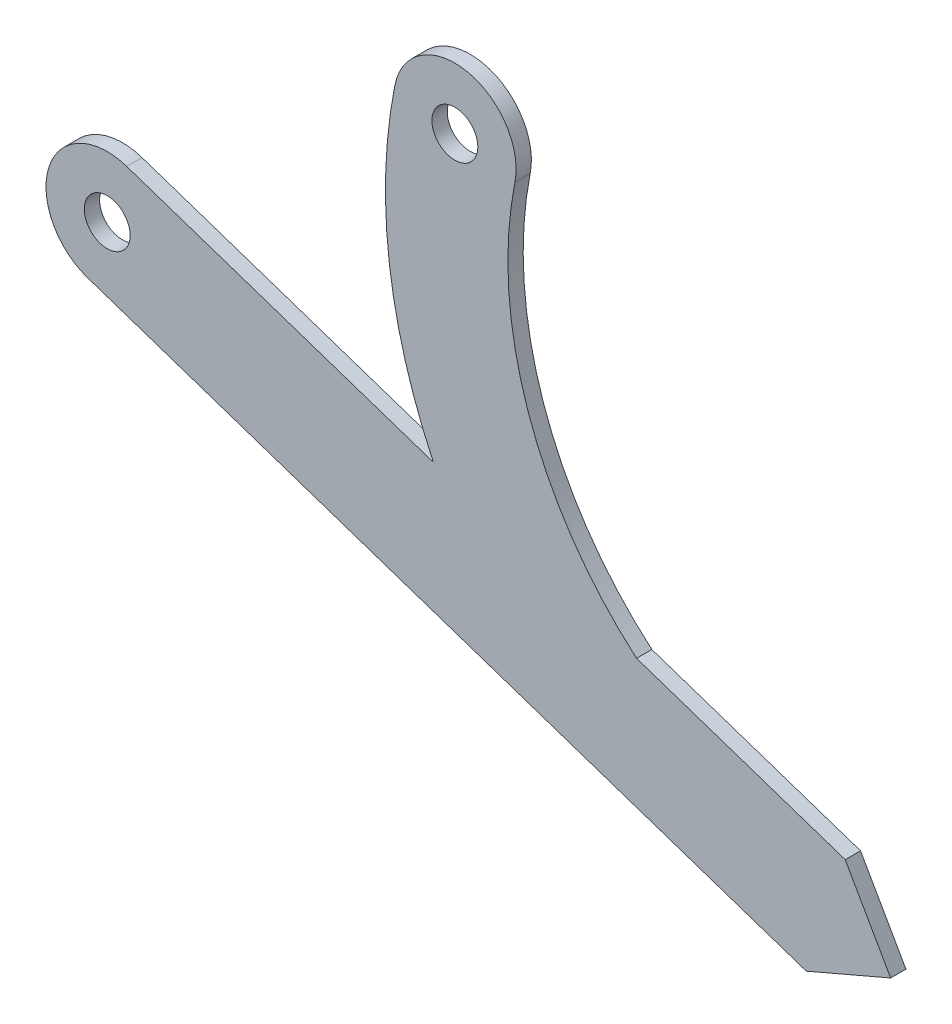
ISO-10303-21;
HEADER;
FILE_DESCRIPTION(('STEP AP214'),'2;1');
FILE_NAME('part.step','',(''),(''),'','','');
FILE_SCHEMA(('AUTOMOTIVE_DESIGN { 1 0 10303 214 1 1 1 1 }'));
ENDSEC;
DATA;
#1=APPLICATION_CONTEXT('core data for automotive mechanical design processes');
#2=APPLICATION_PROTOCOL_DEFINITION('international standard','automotive_design',2000,#1);
#3=PRODUCT_CONTEXT('',#1,'mechanical');
#4=PRODUCT('Part','Part','',(#3));
#5=PRODUCT_RELATED_PRODUCT_CATEGORY('part','',(#4));
#6=PRODUCT_DEFINITION_FORMATION('','',#4);
#7=PRODUCT_DEFINITION_CONTEXT('part definition',#1,'design');
#8=PRODUCT_DEFINITION('design','',#6,#7);
#9=PRODUCT_DEFINITION_SHAPE('','',#8);
#10=(LENGTH_UNIT() NAMED_UNIT(*) SI_UNIT(.MILLI.,.METRE.));
#11=(NAMED_UNIT(*) PLANE_ANGLE_UNIT() SI_UNIT($,.RADIAN.));
#12=(NAMED_UNIT(*) SI_UNIT($,.STERADIAN.) SOLID_ANGLE_UNIT());
#13=UNCERTAINTY_MEASURE_WITH_UNIT(LENGTH_MEASURE(1.E-05),#10,'distance_accuracy_value','');
#14=(GEOMETRIC_REPRESENTATION_CONTEXT(3) GLOBAL_UNCERTAINTY_ASSIGNED_CONTEXT((#13)) GLOBAL_UNIT_ASSIGNED_CONTEXT((#10,
#11,#12)) REPRESENTATION_CONTEXT('',''));
#15=CARTESIAN_POINT('',(0.,0.,0.));
#16=DIRECTION('',(0.,0.,1.));
#17=DIRECTION('',(1.,0.,0.));
#18=AXIS2_PLACEMENT_3D('',#15,#16,#17);
#19=CARTESIAN_POINT('',(-4.19072103136245,-39.3339762298644,1.));
#20=DIRECTION('',(0.,0.,1.));
#21=DIRECTION('',(1.,0.,0.));
#22=AXIS2_PLACEMENT_3D('',#19,#20,#21);
#23=PLANE('',#22);
#24=CARTESIAN_POINT('',(-54.4670684293197,-50.2361322589974,1.));
#25=DIRECTION('',(0.,0.,1.));
#26=DIRECTION('',(1.,0.,0.));
#27=AXIS2_PLACEMENT_3D('',#24,#25,#26);
#28=CIRCLE('',#27,1.5);
#29=CARTESIAN_POINT('',(-52.9670684293197,-50.2361322589974,1.));
#30=VERTEX_POINT('',#29);
#31=EDGE_CURVE('E148',#30,#30,#28,.T.);
#32=ORIENTED_EDGE('',*,*,#31,.F.);
#33=EDGE_LOOP('',(#32));
#34=FACE_BOUND('',#33,.T.);
#35=DIRECTION('',(-0.494588080333751,0.869127511238584,0.));
#36=VECTOR('',#35,1.);
#37=CARTESIAN_POINT('',(-3.27169179195761,-67.4126688993869,1.));
#38=LINE('',#37,#36);
#39=CARTESIAN_POINT('',(-3.27169179195761,-67.4126688993869,1.));
#40=VERTEX_POINT('',#39);
#41=CARTESIAN_POINT('',(-6.23922027396012,-62.1979038319553,1.));
#42=VERTEX_POINT('',#41);
#43=EDGE_CURVE('E161',#40,#42,#38,.T.);
#44=ORIENTED_EDGE('',*,*,#43,.T.);
#45=DIRECTION('',(-0.948062530321522,0.318084011859058,0.));
#46=VECTOR('',#45,1.);
#47=CARTESIAN_POINT('',(-19.8762500679618,-57.6225504053765,1.));
#48=LINE('',#47,#46);
#49=CARTESIAN_POINT('',(-19.8762500679618,-57.6225504053765,1.));
#50=VERTEX_POINT('',#49);
#51=EDGE_CURVE('E104',#42,#50,#48,.T.);
#52=ORIENTED_EDGE('',*,*,#51,.T.);
#53=CARTESIAN_POINT('',(-4.19072103136245,-39.3339762298644,1.));
#54=DIRECTION('',(0.,0.,-1.));
#55=DIRECTION('',(1.,0.,0.));
#56=AXIS2_PLACEMENT_3D('',#53,#54,#55);
#57=CIRCLE('',#56,24.0937287801455);
#58=CARTESIAN_POINT('',(-27.8243929204884,-34.6481124281363,1.));
#59=VERTEX_POINT('',#58);
#60=EDGE_CURVE('E179',#50,#59,#57,.T.);
#61=ORIENTED_EDGE('',*,*,#60,.T.);
#62=CARTESIAN_POINT('',(-31.74801505549,-33.8701732648816,1.));
#63=DIRECTION('',(0.,0.,1.));
#64=DIRECTION('',(1.,0.,0.));
#65=AXIS2_PLACEMENT_3D('',#62,#63,#64);
#66=CIRCLE('',#65,4.);
#67=CARTESIAN_POINT('',(-35.6716371904916,-33.0922341016269,1.));
#68=VERTEX_POINT('',#67);
#69=EDGE_CURVE('E196',#59,#68,#66,.T.);
#70=ORIENTED_EDGE('',*,*,#69,.T.);
#71=CARTESIAN_POINT('',(-4.19072103136245,-39.3339762298644,1.));
#72=DIRECTION('',(0.,0.,1.));
#73=DIRECTION('',(1.,0.,0.));
#74=AXIS2_PLACEMENT_3D('',#71,#72,#73);
#75=CIRCLE('',#74,32.0937287801455);
#76=CARTESIAN_POINT('',(-33.1491254924629,-53.1693742393491,1.));
#77=VERTEX_POINT('',#76);
#78=EDGE_CURVE('E195',#68,#77,#75,.T.);
#79=ORIENTED_EDGE('',*,*,#78,.T.);
#80=DIRECTION('',(-0.948062530321522,0.318084011859058,0.));
#81=VECTOR('',#80,1.);
#82=CARTESIAN_POINT('',(-53.1947323818834,-46.443882137711,1.));
#83=LINE('',#82,#81);
#84=CARTESIAN_POINT('',(-53.1947323818834,-46.443882137711,1.));
#85=VERTEX_POINT('',#84);
#86=EDGE_CURVE('E126',#77,#85,#83,.T.);
#87=ORIENTED_EDGE('',*,*,#86,.T.);
#88=CARTESIAN_POINT('',(-54.4670684293197,-50.2361322589974,1.));
#89=DIRECTION('',(0.,0.,1.));
#90=DIRECTION('',(1.,0.,0.));
#91=AXIS2_PLACEMENT_3D('',#88,#89,#90);
#92=CIRCLE('',#91,4.00000000000029);
#93=CARTESIAN_POINT('',(-55.739404476756,-54.0283823802838,1.));
#94=VERTEX_POINT('',#93);
#95=EDGE_CURVE('E120',#85,#94,#92,.T.);
#96=ORIENTED_EDGE('',*,*,#95,.T.);
#97=DIRECTION('',(0.948062530321522,-0.318084011859058,0.));
#98=VECTOR('',#97,1.);
#99=CARTESIAN_POINT('',(-55.739404476756,-54.0283823802838,1.));
#100=LINE('',#99,#98);
#101=CARTESIAN_POINT('',(-8.78389236883263,-69.7824040745275,1.));
#102=VERTEX_POINT('',#101);
#103=EDGE_CURVE('E124',#94,#102,#100,.T.);
#104=ORIENTED_EDGE('',*,*,#103,.T.);
#105=DIRECTION('',(0.918700096145835,0.394955862523439,0.));
#106=VECTOR('',#105,1.);
#107=CARTESIAN_POINT('',(-3.27169179195761,-67.4126688993869,1.));
#108=LINE('',#107,#106);
#109=EDGE_CURVE('E58',#102,#40,#108,.T.);
#110=ORIENTED_EDGE('',*,*,#109,.T.);
#111=EDGE_LOOP('',(#44,#52,#61,#70,#79,#87,#96,#104,#110));
#112=FACE_BOUND('',#111,.T.);
#113=CARTESIAN_POINT('',(-31.74801505549,-33.8701732648816,1.));
#114=DIRECTION('',(0.,0.,1.));
#115=DIRECTION('',(1.,0.,0.));
#116=AXIS2_PLACEMENT_3D('',#113,#114,#115);
#117=CIRCLE('',#116,1.5);
#118=CARTESIAN_POINT('',(-30.24801505549,-33.8701732648816,1.));
#119=VERTEX_POINT('',#118);
#120=EDGE_CURVE('E206',#119,#119,#117,.T.);
#121=ORIENTED_EDGE('',*,*,#120,.F.);
#122=EDGE_LOOP('',(#121));
#123=FACE_BOUND('',#122,.T.);
#124=ADVANCED_FACE('F41',(#34,#112,#123),#23,.T.);
#125=CARTESIAN_POINT('',(-4.19072103136245,-39.3339762298644,0.));
#126=DIRECTION('',(0.,0.,1.));
#127=DIRECTION('',(1.,0.,0.));
#128=AXIS2_PLACEMENT_3D('',#125,#126,#127);
#129=PLANE('',#128);
#130=DIRECTION('',(-0.494588080333751,0.869127511238584,0.));
#131=VECTOR('',#130,1.);
#132=CARTESIAN_POINT('',(-3.27169179195761,-67.4126688993869,0.));
#133=LINE('',#132,#131);
#134=CARTESIAN_POINT('',(-3.27169179195761,-67.4126688993869,0.));
#135=VERTEX_POINT('',#134);
#136=CARTESIAN_POINT('',(-6.23922027396012,-62.1979038319553,0.));
#137=VERTEX_POINT('',#136);
#138=EDGE_CURVE('E144',#135,#137,#133,.T.);
#139=ORIENTED_EDGE('',*,*,#138,.F.);
#140=DIRECTION('',(0.918700096145835,0.394955862523439,0.));
#141=VECTOR('',#140,1.);
#142=CARTESIAN_POINT('',(-3.27169179195761,-67.4126688993869,0.));
#143=LINE('',#142,#141);
#144=CARTESIAN_POINT('',(-8.78389236883263,-69.7824040745275,0.));
#145=VERTEX_POINT('',#144);
#146=EDGE_CURVE('E96',#145,#135,#143,.T.);
#147=ORIENTED_EDGE('',*,*,#146,.F.);
#148=DIRECTION('',(0.948062530321522,-0.318084011859058,0.));
#149=VECTOR('',#148,1.);
#150=CARTESIAN_POINT('',(-55.739404476756,-54.0283823802838,0.));
#151=LINE('',#150,#149);
#152=CARTESIAN_POINT('',(-55.739404476756,-54.0283823802838,0.));
#153=VERTEX_POINT('',#152);
#154=EDGE_CURVE('E90',#153,#145,#151,.T.);
#155=ORIENTED_EDGE('',*,*,#154,.F.);
#156=CARTESIAN_POINT('',(-54.4670684293197,-50.2361322589974,0.));
#157=DIRECTION('',(0.,0.,1.));
#158=DIRECTION('',(1.,0.,0.));
#159=AXIS2_PLACEMENT_3D('',#156,#157,#158);
#160=CIRCLE('',#159,4.00000000000029);
#161=CARTESIAN_POINT('',(-53.1947323818834,-46.443882137711,0.));
#162=VERTEX_POINT('',#161);
#163=EDGE_CURVE('E134',#162,#153,#160,.T.);
#164=ORIENTED_EDGE('',*,*,#163,.F.);
#165=DIRECTION('',(-0.948062530321522,0.318084011859058,0.));
#166=VECTOR('',#165,1.);
#167=CARTESIAN_POINT('',(-53.1947323818834,-46.443882137711,0.));
#168=LINE('',#167,#166);
#169=CARTESIAN_POINT('',(-33.1491254924629,-53.1693742393491,0.));
#170=VERTEX_POINT('',#169);
#171=EDGE_CURVE('E156',#170,#162,#168,.T.);
#172=ORIENTED_EDGE('',*,*,#171,.F.);
#173=CARTESIAN_POINT('',(-4.19072103136245,-39.3339762298644,0.));
#174=DIRECTION('',(0.,0.,1.));
#175=DIRECTION('',(1.,0.,0.));
#176=AXIS2_PLACEMENT_3D('',#173,#174,#175);
#177=CIRCLE('',#176,32.0937287801455);
#178=CARTESIAN_POINT('',(-35.6716371904916,-33.0922341016269,0.));
#179=VERTEX_POINT('',#178);
#180=EDGE_CURVE('E154',#179,#170,#177,.T.);
#181=ORIENTED_EDGE('',*,*,#180,.F.);
#182=CARTESIAN_POINT('',(-31.74801505549,-33.8701732648816,0.));
#183=DIRECTION('',(0.,0.,1.));
#184=DIRECTION('',(1.,0.,0.));
#185=AXIS2_PLACEMENT_3D('',#182,#183,#184);
#186=CIRCLE('',#185,4.);
#187=CARTESIAN_POINT('',(-27.8243929204884,-34.6481124281363,0.));
#188=VERTEX_POINT('',#187);
#189=EDGE_CURVE('E152',#188,#179,#186,.T.);
#190=ORIENTED_EDGE('',*,*,#189,.F.);
#191=CARTESIAN_POINT('',(-4.19072103136245,-39.3339762298644,0.));
#192=DIRECTION('',(0.,0.,-1.));
#193=DIRECTION('',(1.,0.,0.));
#194=AXIS2_PLACEMENT_3D('',#191,#192,#193);
#195=CIRCLE('',#194,24.0937287801455);
#196=CARTESIAN_POINT('',(-19.8762500679618,-57.6225504053765,0.));
#197=VERTEX_POINT('',#196);
#198=EDGE_CURVE('E150',#197,#188,#195,.T.);
#199=ORIENTED_EDGE('',*,*,#198,.F.);
#200=DIRECTION('',(-0.948062530321522,0.318084011859058,0.));
#201=VECTOR('',#200,1.);
#202=CARTESIAN_POINT('',(-19.8762500679618,-57.6225504053765,0.));
#203=LINE('',#202,#201);
#204=EDGE_CURVE('E147',#137,#197,#203,.T.);
#205=ORIENTED_EDGE('',*,*,#204,.F.);
#206=EDGE_LOOP('',(#139,#147,#155,#164,#172,#181,#190,#199,#205));
#207=FACE_BOUND('',#206,.T.);
#208=CARTESIAN_POINT('',(-54.4670684293197,-50.2361322589974,0.));
#209=DIRECTION('',(0.,0.,1.));
#210=DIRECTION('',(1.,0.,0.));
#211=AXIS2_PLACEMENT_3D('',#208,#209,#210);
#212=CIRCLE('',#211,1.5);
#213=CARTESIAN_POINT('',(-52.9670684293197,-50.2361322589974,0.));
#214=VERTEX_POINT('',#213);
#215=EDGE_CURVE('E203',#214,#214,#212,.T.);
#216=ORIENTED_EDGE('',*,*,#215,.T.);
#217=EDGE_LOOP('',(#216));
#218=FACE_BOUND('',#217,.T.);
#219=CARTESIAN_POINT('',(-31.74801505549,-33.8701732648816,0.));
#220=DIRECTION('',(0.,0.,1.));
#221=DIRECTION('',(1.,0.,0.));
#222=AXIS2_PLACEMENT_3D('',#219,#220,#221);
#223=CIRCLE('',#222,1.5);
#224=CARTESIAN_POINT('',(-30.24801505549,-33.8701732648816,0.));
#225=VERTEX_POINT('',#224);
#226=EDGE_CURVE('E209',#225,#225,#223,.T.);
#227=ORIENTED_EDGE('',*,*,#226,.T.);
#228=EDGE_LOOP('',(#227));
#229=FACE_BOUND('',#228,.T.);
#230=ADVANCED_FACE('F183',(#207,#218,#229),#129,.F.);
#231=CARTESIAN_POINT('',(-3.27169179195761,-67.4126688993869,1.));
#232=DIRECTION('',(-0.869127511238584,-0.494588080333751,0.));
#233=DIRECTION('',(0.494588080333751,-0.869127511238584,0.));
#234=AXIS2_PLACEMENT_3D('',#231,#232,#233);
#235=PLANE('',#234);
#236=ORIENTED_EDGE('',*,*,#138,.T.);
#237=DIRECTION('',(0.,0.,-1.));
#238=VECTOR('',#237,1.);
#239=CARTESIAN_POINT('',(-6.23922027396012,-62.1979038319553,1.));
#240=LINE('',#239,#238);
#241=EDGE_CURVE('E11',#42,#137,#240,.T.);
#242=ORIENTED_EDGE('',*,*,#241,.F.);
#243=ORIENTED_EDGE('',*,*,#43,.F.);
#244=DIRECTION('',(0.,0.,-1.));
#245=VECTOR('',#244,1.);
#246=CARTESIAN_POINT('',(-3.27169179195761,-67.4126688993869,1.));
#247=LINE('',#246,#245);
#248=EDGE_CURVE('E140',#40,#135,#247,.T.);
#249=ORIENTED_EDGE('',*,*,#248,.T.);
#250=EDGE_LOOP('',(#236,#242,#243,#249));
#251=FACE_BOUND('',#250,.T.);
#252=ADVANCED_FACE('F43',(#251),#235,.F.);
#253=CARTESIAN_POINT('',(-19.8762500679618,-57.6225504053765,1.));
#254=DIRECTION('',(-0.318084011859058,-0.948062530321522,0.));
#255=DIRECTION('',(0.948062530321522,-0.318084011859058,0.));
#256=AXIS2_PLACEMENT_3D('',#253,#254,#255);
#257=PLANE('',#256);
#258=ORIENTED_EDGE('',*,*,#204,.T.);
#259=DIRECTION('',(0.,0.,-1.));
#260=VECTOR('',#259,1.);
#261=CARTESIAN_POINT('',(-19.8762500679618,-57.6225504053765,1.));
#262=LINE('',#261,#260);
#263=EDGE_CURVE('E50',#50,#197,#262,.T.);
#264=ORIENTED_EDGE('',*,*,#263,.F.);
#265=ORIENTED_EDGE('',*,*,#51,.F.);
#266=ORIENTED_EDGE('',*,*,#241,.T.);
#267=EDGE_LOOP('',(#258,#264,#265,#266));
#268=FACE_BOUND('',#267,.T.);
#269=ADVANCED_FACE('F245',(#268),#257,.F.);
#270=CARTESIAN_POINT('',(-4.19072103136245,-39.3339762298644,1.));
#271=DIRECTION('',(0.,0.,-1.));
#272=DIRECTION('',(-1.,0.,0.));
#273=AXIS2_PLACEMENT_3D('',#270,#271,#272);
#274=CYLINDRICAL_SURFACE('',#273,24.0937287801455);
#275=ORIENTED_EDGE('',*,*,#198,.T.);
#276=DIRECTION('',(0.,0.,-1.));
#277=VECTOR('',#276,1.);
#278=CARTESIAN_POINT('',(-27.8243929204884,-34.6481124281363,1.));
#279=LINE('',#278,#277);
#280=EDGE_CURVE('E171',#59,#188,#279,.T.);
#281=ORIENTED_EDGE('',*,*,#280,.F.);
#282=ORIENTED_EDGE('',*,*,#60,.F.);
#283=ORIENTED_EDGE('',*,*,#263,.T.);
#284=EDGE_LOOP('',(#275,#281,#282,#283));
#285=FACE_BOUND('',#284,.T.);
#286=ADVANCED_FACE('F177',(#285),#274,.F.);
#287=CARTESIAN_POINT('',(-31.74801505549,-33.8701732648816,1.));
#288=DIRECTION('',(0.,0.,-1.));
#289=DIRECTION('',(-1.,0.,0.));
#290=AXIS2_PLACEMENT_3D('',#287,#288,#289);
#291=CYLINDRICAL_SURFACE('',#290,4.);
#292=ORIENTED_EDGE('',*,*,#189,.T.);
#293=DIRECTION('',(0.,0.,-1.));
#294=VECTOR('',#293,1.);
#295=CARTESIAN_POINT('',(-35.6716371904916,-33.0922341016269,1.));
#296=LINE('',#295,#294);
#297=EDGE_CURVE('E168',#68,#179,#296,.T.);
#298=ORIENTED_EDGE('',*,*,#297,.F.);
#299=ORIENTED_EDGE('',*,*,#69,.F.);
#300=ORIENTED_EDGE('',*,*,#280,.T.);
#301=EDGE_LOOP('',(#292,#298,#299,#300));
#302=FACE_BOUND('',#301,.T.);
#303=ADVANCED_FACE('F189',(#302),#291,.T.);
#304=CARTESIAN_POINT('',(-4.19072103136245,-39.3339762298644,1.));
#305=DIRECTION('',(0.,0.,-1.));
#306=DIRECTION('',(-1.,0.,0.));
#307=AXIS2_PLACEMENT_3D('',#304,#305,#306);
#308=CYLINDRICAL_SURFACE('',#307,32.0937287801455);
#309=ORIENTED_EDGE('',*,*,#180,.T.);
#310=DIRECTION('',(0.,0.,-1.));
#311=VECTOR('',#310,1.);
#312=CARTESIAN_POINT('',(-33.1491254924629,-53.1693742393491,1.));
#313=LINE('',#312,#311);
#314=EDGE_CURVE('E165',#77,#170,#313,.T.);
#315=ORIENTED_EDGE('',*,*,#314,.F.);
#316=ORIENTED_EDGE('',*,*,#78,.F.);
#317=ORIENTED_EDGE('',*,*,#297,.T.);
#318=EDGE_LOOP('',(#309,#315,#316,#317));
#319=FACE_BOUND('',#318,.T.);
#320=ADVANCED_FACE('F193',(#319),#308,.T.);
#321=CARTESIAN_POINT('',(-53.1947323818834,-46.443882137711,1.));
#322=DIRECTION('',(-0.318084011859058,-0.948062530321522,0.));
#323=DIRECTION('',(0.948062530321522,-0.318084011859058,0.));
#324=AXIS2_PLACEMENT_3D('',#321,#322,#323);
#325=PLANE('',#324);
#326=ORIENTED_EDGE('',*,*,#171,.T.);
#327=DIRECTION('',(0.,0.,-1.));
#328=VECTOR('',#327,1.);
#329=CARTESIAN_POINT('',(-53.1947323818834,-46.443882137711,1.));
#330=LINE('',#329,#328);
#331=EDGE_CURVE('E135',#85,#162,#330,.T.);
#332=ORIENTED_EDGE('',*,*,#331,.F.);
#333=ORIENTED_EDGE('',*,*,#86,.F.);
#334=ORIENTED_EDGE('',*,*,#314,.T.);
#335=EDGE_LOOP('',(#326,#332,#333,#334));
#336=FACE_BOUND('',#335,.T.);
#337=ADVANCED_FACE('F236',(#336),#325,.F.);
#338=CARTESIAN_POINT('',(-54.4670684293197,-50.2361322589974,1.));
#339=DIRECTION('',(0.,0.,-1.));
#340=DIRECTION('',(-1.,0.,0.));
#341=AXIS2_PLACEMENT_3D('',#338,#339,#340);
#342=CYLINDRICAL_SURFACE('',#341,4.00000000000029);
#343=ORIENTED_EDGE('',*,*,#163,.T.);
#344=DIRECTION('',(0.,0.,-1.));
#345=VECTOR('',#344,1.);
#346=CARTESIAN_POINT('',(-55.739404476756,-54.0283823802838,1.));
#347=LINE('',#346,#345);
#348=EDGE_CURVE('E131',#94,#153,#347,.T.);
#349=ORIENTED_EDGE('',*,*,#348,.F.);
#350=ORIENTED_EDGE('',*,*,#95,.F.);
#351=ORIENTED_EDGE('',*,*,#331,.T.);
#352=EDGE_LOOP('',(#343,#349,#350,#351));
#353=FACE_BOUND('',#352,.T.);
#354=ADVANCED_FACE('F132',(#353),#342,.T.);
#355=CARTESIAN_POINT('',(-55.739404476756,-54.0283823802838,1.));
#356=DIRECTION('',(0.318084011859058,0.948062530321522,0.));
#357=DIRECTION('',(-0.948062530321522,0.318084011859058,0.));
#358=AXIS2_PLACEMENT_3D('',#355,#356,#357);
#359=PLANE('',#358);
#360=ORIENTED_EDGE('',*,*,#154,.T.);
#361=DIRECTION('',(0.,0.,-1.));
#362=VECTOR('',#361,1.);
#363=CARTESIAN_POINT('',(-8.78389236883263,-69.7824040745275,1.));
#364=LINE('',#363,#362);
#365=EDGE_CURVE('E136',#102,#145,#364,.T.);
#366=ORIENTED_EDGE('',*,*,#365,.F.);
#367=ORIENTED_EDGE('',*,*,#103,.F.);
#368=ORIENTED_EDGE('',*,*,#348,.T.);
#369=EDGE_LOOP('',(#360,#366,#367,#368));
#370=FACE_BOUND('',#369,.T.);
#371=ADVANCED_FACE('F138',(#370),#359,.F.);
#372=CARTESIAN_POINT('',(-3.27169179195761,-67.4126688993869,1.));
#373=DIRECTION('',(-0.394955862523439,0.918700096145835,0.));
#374=DIRECTION('',(-0.918700096145835,-0.394955862523439,0.));
#375=AXIS2_PLACEMENT_3D('',#372,#373,#374);
#376=PLANE('',#375);
#377=ORIENTED_EDGE('',*,*,#146,.T.);
#378=ORIENTED_EDGE('',*,*,#248,.F.);
#379=ORIENTED_EDGE('',*,*,#109,.F.);
#380=ORIENTED_EDGE('',*,*,#365,.T.);
#381=EDGE_LOOP('',(#377,#378,#379,#380));
#382=FACE_BOUND('',#381,.T.);
#383=ADVANCED_FACE('F229',(#382),#376,.F.);
#384=CARTESIAN_POINT('',(-54.4670684293197,-50.2361322589974,1.));
#385=DIRECTION('',(0.,0.,-1.));
#386=DIRECTION('',(-1.,0.,0.));
#387=AXIS2_PLACEMENT_3D('',#384,#385,#386);
#388=CYLINDRICAL_SURFACE('',#387,1.5);
#389=ORIENTED_EDGE('',*,*,#31,.T.);
#390=EDGE_LOOP('',(#389));
#391=FACE_BOUND('',#390,.T.);
#392=ORIENTED_EDGE('',*,*,#215,.F.);
#393=EDGE_LOOP('',(#392));
#394=FACE_BOUND('',#393,.T.);
#395=ADVANCED_FACE('F226',(#391,#394),#388,.F.);
#396=CARTESIAN_POINT('',(-31.74801505549,-33.8701732648816,1.));
#397=DIRECTION('',(0.,0.,-1.));
#398=DIRECTION('',(-1.,0.,0.));
#399=AXIS2_PLACEMENT_3D('',#396,#397,#398);
#400=CYLINDRICAL_SURFACE('',#399,1.5);
#401=ORIENTED_EDGE('',*,*,#120,.T.);
#402=EDGE_LOOP('',(#401));
#403=FACE_BOUND('',#402,.T.);
#404=ORIENTED_EDGE('',*,*,#226,.F.);
#405=EDGE_LOOP('',(#404));
#406=FACE_BOUND('',#405,.T.);
#407=ADVANCED_FACE('F215',(#403,#406),#400,.F.);
#408=CLOSED_SHELL('',(#124,#230,#252,#269,#286,#303,#320,#337,#354,#371,#383,#395,#407));
#409=MANIFOLD_SOLID_BREP('B2',#408);
#410=ADVANCED_BREP_SHAPE_REPRESENTATION('',(#18,#409),#14);
#411=SHAPE_DEFINITION_REPRESENTATION(#9,#410);
ENDSEC;
END-ISO-10303-21;
